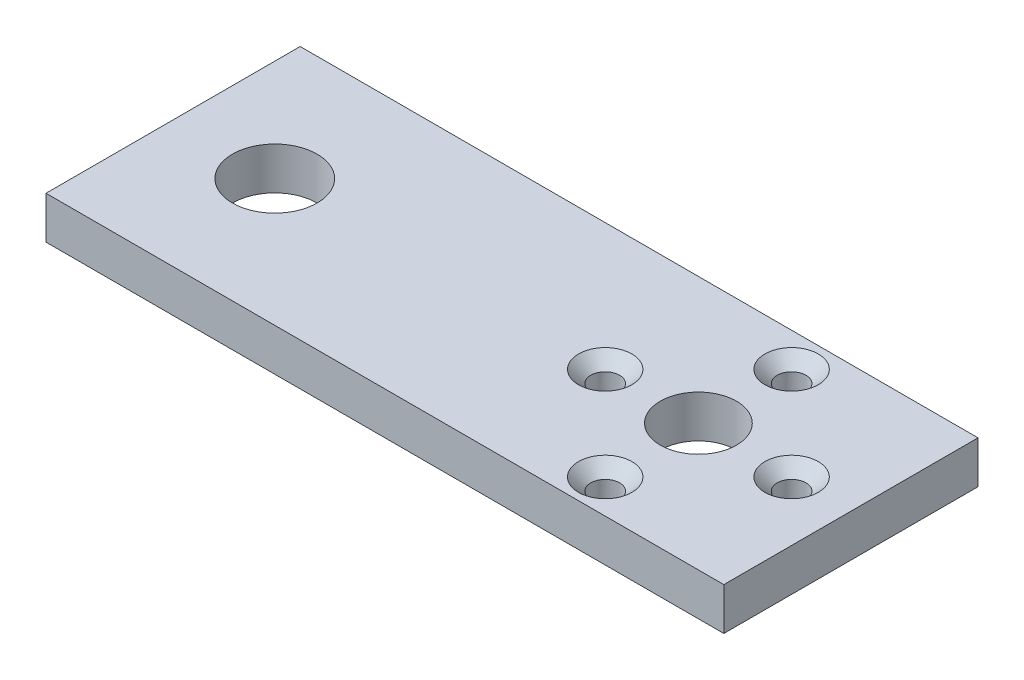
ISO-10303-21;
HEADER;
FILE_DESCRIPTION(('STEP AP214'),'2;1');
FILE_NAME('part.step','',(''),(''),'','','');
FILE_SCHEMA(('AUTOMOTIVE_DESIGN { 1 0 10303 214 1 1 1 1 }'));
ENDSEC;
DATA;
#1=APPLICATION_CONTEXT('core data for automotive mechanical design processes');
#2=APPLICATION_PROTOCOL_DEFINITION('international standard','automotive_design',2000,#1);
#3=PRODUCT_CONTEXT('',#1,'mechanical');
#4=PRODUCT('Part','Part','',(#3));
#5=PRODUCT_RELATED_PRODUCT_CATEGORY('part','',(#4));
#6=PRODUCT_DEFINITION_FORMATION('','',#4);
#7=PRODUCT_DEFINITION_CONTEXT('part definition',#1,'design');
#8=PRODUCT_DEFINITION('design','',#6,#7);
#9=PRODUCT_DEFINITION_SHAPE('','',#8);
#10=(LENGTH_UNIT() NAMED_UNIT(*) SI_UNIT(.MILLI.,.METRE.));
#11=(NAMED_UNIT(*) PLANE_ANGLE_UNIT() SI_UNIT($,.RADIAN.));
#12=(NAMED_UNIT(*) SI_UNIT($,.STERADIAN.) SOLID_ANGLE_UNIT());
#13=UNCERTAINTY_MEASURE_WITH_UNIT(LENGTH_MEASURE(1.E-05),#10,'distance_accuracy_value','');
#14=(GEOMETRIC_REPRESENTATION_CONTEXT(3) GLOBAL_UNCERTAINTY_ASSIGNED_CONTEXT((#13)) GLOBAL_UNIT_ASSIGNED_CONTEXT((#10,
#11,#12)) REPRESENTATION_CONTEXT('',''));
#15=CARTESIAN_POINT('',(0.,0.,0.));
#16=DIRECTION('',(0.,0.,1.));
#17=DIRECTION('',(1.,0.,0.));
#18=AXIS2_PLACEMENT_3D('',#15,#16,#17);
#19=CARTESIAN_POINT('',(0.,5.,0.));
#20=DIRECTION('',(0.,-1.,0.));
#21=DIRECTION('',(0.,0.,-1.));
#22=AXIS2_PLACEMENT_3D('',#19,#20,#21);
#23=PLANE('',#22);
#24=CARTESIAN_POINT('',(21.9999999999999,5.,11.));
#25=DIRECTION('',(0.,1.,0.));
#26=DIRECTION('',(0.,0.,1.));
#27=AXIS2_PLACEMENT_3D('',#24,#25,#26);
#28=CIRCLE('',#27,3.15);
#29=CARTESIAN_POINT('',(21.9999999999999,5.,14.15));
#30=VERTEX_POINT('',#29);
#31=EDGE_CURVE('E266',#30,#30,#28,.T.);
#32=ORIENTED_EDGE('',*,*,#31,.F.);
#33=EDGE_LOOP('',(#32));
#34=FACE_BOUND('',#33,.T.);
#35=CARTESIAN_POINT('',(22.,5.,-11.));
#36=DIRECTION('',(0.,1.,0.));
#37=DIRECTION('',(0.,0.,1.));
#38=AXIS2_PLACEMENT_3D('',#35,#36,#37);
#39=CIRCLE('',#38,3.15);
#40=CARTESIAN_POINT('',(22.,5.,-7.85));
#41=VERTEX_POINT('',#40);
#42=EDGE_CURVE('E242',#41,#41,#39,.T.);
#43=ORIENTED_EDGE('',*,*,#42,.F.);
#44=EDGE_LOOP('',(#43));
#45=FACE_BOUND('',#44,.T.);
#46=CARTESIAN_POINT('',(11.,5.,0.));
#47=DIRECTION('',(0.,1.,0.));
#48=DIRECTION('',(0.,0.,1.));
#49=AXIS2_PLACEMENT_3D('',#46,#47,#48);
#50=CIRCLE('',#49,3.15);
#51=CARTESIAN_POINT('',(11.,5.,3.15));
#52=VERTEX_POINT('',#51);
#53=EDGE_CURVE('E230',#52,#52,#50,.T.);
#54=ORIENTED_EDGE('',*,*,#53,.F.);
#55=EDGE_LOOP('',(#54));
#56=FACE_BOUND('',#55,.T.);
#57=DIRECTION('',(0.,0.,-1.));
#58=VECTOR('',#57,1.);
#59=CARTESIAN_POINT('',(-40.,5.,15.));
#60=LINE('',#59,#58);
#61=CARTESIAN_POINT('',(-40.,5.,15.));
#62=VERTEX_POINT('',#61);
#63=CARTESIAN_POINT('',(-40.,5.,-15.));
#64=VERTEX_POINT('',#63);
#65=EDGE_CURVE('E146',#62,#64,#60,.T.);
#66=ORIENTED_EDGE('',*,*,#65,.F.);
#67=DIRECTION('',(1.,0.,0.));
#68=VECTOR('',#67,1.);
#69=CARTESIAN_POINT('',(-40.,5.,15.));
#70=LINE('',#69,#68);
#71=CARTESIAN_POINT('',(40.,5.,15.));
#72=VERTEX_POINT('',#71);
#73=EDGE_CURVE('E133',#62,#72,#70,.T.);
#74=ORIENTED_EDGE('',*,*,#73,.T.);
#75=DIRECTION('',(0.,0.,-1.));
#76=VECTOR('',#75,1.);
#77=CARTESIAN_POINT('',(40.,5.,15.));
#78=LINE('',#77,#76);
#79=CARTESIAN_POINT('',(40.,5.,-15.));
#80=VERTEX_POINT('',#79);
#81=EDGE_CURVE('E128',#72,#80,#78,.T.);
#82=ORIENTED_EDGE('',*,*,#81,.T.);
#83=DIRECTION('',(1.,0.,0.));
#84=VECTOR('',#83,1.);
#85=CARTESIAN_POINT('',(-40.,5.,-15.));
#86=LINE('',#85,#84);
#87=EDGE_CURVE('E132',#64,#80,#86,.T.);
#88=ORIENTED_EDGE('',*,*,#87,.F.);
#89=EDGE_LOOP('',(#66,#74,#82,#88));
#90=FACE_BOUND('',#89,.T.);
#91=CARTESIAN_POINT('',(22.,5.,0.));
#92=DIRECTION('',(0.,1.,0.));
#93=DIRECTION('',(0.,0.,1.));
#94=AXIS2_PLACEMENT_3D('',#91,#92,#93);
#95=CIRCLE('',#94,4.5);
#96=CARTESIAN_POINT('',(22.,5.,4.5));
#97=VERTEX_POINT('',#96);
#98=EDGE_CURVE('E159',#97,#97,#95,.T.);
#99=ORIENTED_EDGE('',*,*,#98,.F.);
#100=EDGE_LOOP('',(#99));
#101=FACE_BOUND('',#100,.T.);
#102=CARTESIAN_POINT('',(-28.,5.,0.));
#103=DIRECTION('',(0.,1.,0.));
#104=DIRECTION('',(0.,0.,1.));
#105=AXIS2_PLACEMENT_3D('',#102,#103,#104);
#106=CIRCLE('',#105,5.);
#107=CARTESIAN_POINT('',(-28.,5.,5.));
#108=VERTEX_POINT('',#107);
#109=EDGE_CURVE('E211',#108,#108,#106,.T.);
#110=ORIENTED_EDGE('',*,*,#109,.F.);
#111=EDGE_LOOP('',(#110));
#112=FACE_BOUND('',#111,.T.);
#113=CARTESIAN_POINT('',(33.,5.,0.));
#114=DIRECTION('',(0.,1.,0.));
#115=DIRECTION('',(0.,0.,1.));
#116=AXIS2_PLACEMENT_3D('',#113,#114,#115);
#117=CIRCLE('',#116,3.15);
#118=CARTESIAN_POINT('',(33.,5.,3.15));
#119=VERTEX_POINT('',#118);
#120=EDGE_CURVE('E254',#119,#119,#117,.T.);
#121=ORIENTED_EDGE('',*,*,#120,.F.);
#122=EDGE_LOOP('',(#121));
#123=FACE_BOUND('',#122,.T.);
#124=ADVANCED_FACE('F81',(#34,#45,#56,#90,#101,#112,#123),#23,.F.);
#125=CARTESIAN_POINT('',(0.,0.,0.));
#126=DIRECTION('',(0.,-1.,0.));
#127=DIRECTION('',(0.,0.,-1.));
#128=AXIS2_PLACEMENT_3D('',#125,#126,#127);
#129=PLANE('',#128);
#130=CARTESIAN_POINT('',(21.9999999999999,0.,11.));
#131=DIRECTION('',(0.,-1.,0.));
#132=DIRECTION('',(0.,0.,-1.));
#133=AXIS2_PLACEMENT_3D('',#130,#131,#132);
#134=CIRCLE('',#133,1.7);
#135=CARTESIAN_POINT('',(21.9999999999999,0.,9.3));
#136=VERTEX_POINT('',#135);
#137=EDGE_CURVE('E258',#136,#136,#134,.T.);
#138=ORIENTED_EDGE('',*,*,#137,.F.);
#139=EDGE_LOOP('',(#138));
#140=FACE_BOUND('',#139,.T.);
#141=CARTESIAN_POINT('',(33.,0.,0.));
#142=DIRECTION('',(0.,-1.,0.));
#143=DIRECTION('',(0.,0.,-1.));
#144=AXIS2_PLACEMENT_3D('',#141,#142,#143);
#145=CIRCLE('',#144,1.7);
#146=CARTESIAN_POINT('',(33.,0.,-1.7));
#147=VERTEX_POINT('',#146);
#148=EDGE_CURVE('E246',#147,#147,#145,.T.);
#149=ORIENTED_EDGE('',*,*,#148,.F.);
#150=EDGE_LOOP('',(#149));
#151=FACE_BOUND('',#150,.T.);
#152=CARTESIAN_POINT('',(22.,0.,-11.));
#153=DIRECTION('',(0.,-1.,0.));
#154=DIRECTION('',(0.,0.,-1.));
#155=AXIS2_PLACEMENT_3D('',#152,#153,#154);
#156=CIRCLE('',#155,1.7);
#157=CARTESIAN_POINT('',(22.,0.,-12.7));
#158=VERTEX_POINT('',#157);
#159=EDGE_CURVE('E234',#158,#158,#156,.T.);
#160=ORIENTED_EDGE('',*,*,#159,.F.);
#161=EDGE_LOOP('',(#160));
#162=FACE_BOUND('',#161,.T.);
#163=CARTESIAN_POINT('',(11.,0.,0.));
#164=DIRECTION('',(0.,-1.,0.));
#165=DIRECTION('',(0.,0.,-1.));
#166=AXIS2_PLACEMENT_3D('',#163,#164,#165);
#167=CIRCLE('',#166,1.7);
#168=CARTESIAN_POINT('',(11.,0.,-1.7));
#169=VERTEX_POINT('',#168);
#170=EDGE_CURVE('E221',#169,#169,#167,.T.);
#171=ORIENTED_EDGE('',*,*,#170,.F.);
#172=EDGE_LOOP('',(#171));
#173=FACE_BOUND('',#172,.T.);
#174=CARTESIAN_POINT('',(22.,0.,0.));
#175=DIRECTION('',(0.,1.,0.));
#176=DIRECTION('',(0.,0.,1.));
#177=AXIS2_PLACEMENT_3D('',#174,#175,#176);
#178=CIRCLE('',#177,4.5);
#179=CARTESIAN_POINT('',(22.,0.,4.5));
#180=VERTEX_POINT('',#179);
#181=EDGE_CURVE('E208',#180,#180,#178,.T.);
#182=ORIENTED_EDGE('',*,*,#181,.T.);
#183=EDGE_LOOP('',(#182));
#184=FACE_BOUND('',#183,.T.);
#185=DIRECTION('',(0.,0.,-1.));
#186=VECTOR('',#185,1.);
#187=CARTESIAN_POINT('',(-40.,0.,15.));
#188=LINE('',#187,#186);
#189=CARTESIAN_POINT('',(-40.,0.,15.));
#190=VERTEX_POINT('',#189);
#191=CARTESIAN_POINT('',(-40.,0.,-15.));
#192=VERTEX_POINT('',#191);
#193=EDGE_CURVE('E154',#190,#192,#188,.T.);
#194=ORIENTED_EDGE('',*,*,#193,.T.);
#195=DIRECTION('',(1.,0.,0.));
#196=VECTOR('',#195,1.);
#197=CARTESIAN_POINT('',(-40.,0.,-15.));
#198=LINE('',#197,#196);
#199=CARTESIAN_POINT('',(40.,0.,-15.));
#200=VERTEX_POINT('',#199);
#201=EDGE_CURVE('E158',#192,#200,#198,.T.);
#202=ORIENTED_EDGE('',*,*,#201,.T.);
#203=DIRECTION('',(0.,0.,-1.));
#204=VECTOR('',#203,1.);
#205=CARTESIAN_POINT('',(40.,0.,15.));
#206=LINE('',#205,#204);
#207=CARTESIAN_POINT('',(40.,0.,15.));
#208=VERTEX_POINT('',#207);
#209=EDGE_CURVE('E141',#208,#200,#206,.T.);
#210=ORIENTED_EDGE('',*,*,#209,.F.);
#211=DIRECTION('',(1.,0.,0.));
#212=VECTOR('',#211,1.);
#213=CARTESIAN_POINT('',(-40.,0.,15.));
#214=LINE('',#213,#212);
#215=EDGE_CURVE('E116',#190,#208,#214,.T.);
#216=ORIENTED_EDGE('',*,*,#215,.F.);
#217=EDGE_LOOP('',(#194,#202,#210,#216));
#218=FACE_BOUND('',#217,.T.);
#219=CARTESIAN_POINT('',(-28.,0.,0.));
#220=DIRECTION('',(0.,1.,0.));
#221=DIRECTION('',(0.,0.,1.));
#222=AXIS2_PLACEMENT_3D('',#219,#220,#221);
#223=CIRCLE('',#222,5.);
#224=CARTESIAN_POINT('',(-28.,0.,5.));
#225=VERTEX_POINT('',#224);
#226=EDGE_CURVE('E216',#225,#225,#223,.T.);
#227=ORIENTED_EDGE('',*,*,#226,.T.);
#228=EDGE_LOOP('',(#227));
#229=FACE_BOUND('',#228,.T.);
#230=ADVANCED_FACE('F168',(#140,#151,#162,#173,#184,#218,#229),#129,.T.);
#231=CARTESIAN_POINT('',(-40.,5.,15.));
#232=DIRECTION('',(-1.,0.,0.));
#233=DIRECTION('',(0.,0.,1.));
#234=AXIS2_PLACEMENT_3D('',#231,#232,#233);
#235=PLANE('',#234);
#236=ORIENTED_EDGE('',*,*,#193,.F.);
#237=DIRECTION('',(0.,-1.,0.));
#238=VECTOR('',#237,1.);
#239=CARTESIAN_POINT('',(-40.,5.,15.));
#240=LINE('',#239,#238);
#241=EDGE_CURVE('E14',#62,#190,#240,.T.);
#242=ORIENTED_EDGE('',*,*,#241,.F.);
#243=ORIENTED_EDGE('',*,*,#65,.T.);
#244=DIRECTION('',(0.,-1.,0.));
#245=VECTOR('',#244,1.);
#246=CARTESIAN_POINT('',(-40.,5.,-15.));
#247=LINE('',#246,#245);
#248=EDGE_CURVE('E85',#64,#192,#247,.T.);
#249=ORIENTED_EDGE('',*,*,#248,.T.);
#250=EDGE_LOOP('',(#236,#242,#243,#249));
#251=FACE_BOUND('',#250,.T.);
#252=ADVANCED_FACE('F83',(#251),#235,.T.);
#253=CARTESIAN_POINT('',(-40.,5.,15.));
#254=DIRECTION('',(0.,0.,-1.));
#255=DIRECTION('',(-1.,0.,0.));
#256=AXIS2_PLACEMENT_3D('',#253,#254,#255);
#257=PLANE('',#256);
#258=ORIENTED_EDGE('',*,*,#215,.T.);
#259=DIRECTION('',(0.,-1.,0.));
#260=VECTOR('',#259,1.);
#261=CARTESIAN_POINT('',(40.,5.,15.));
#262=LINE('',#261,#260);
#263=EDGE_CURVE('E92',#72,#208,#262,.T.);
#264=ORIENTED_EDGE('',*,*,#263,.F.);
#265=ORIENTED_EDGE('',*,*,#73,.F.);
#266=ORIENTED_EDGE('',*,*,#241,.T.);
#267=EDGE_LOOP('',(#258,#264,#265,#266));
#268=FACE_BOUND('',#267,.T.);
#269=ADVANCED_FACE('F172',(#268),#257,.F.);
#270=CARTESIAN_POINT('',(40.,5.,15.));
#271=DIRECTION('',(-1.,0.,0.));
#272=DIRECTION('',(0.,0.,1.));
#273=AXIS2_PLACEMENT_3D('',#270,#271,#272);
#274=PLANE('',#273);
#275=ORIENTED_EDGE('',*,*,#209,.T.);
#276=DIRECTION('',(0.,-1.,0.));
#277=VECTOR('',#276,1.);
#278=CARTESIAN_POINT('',(40.,5.,-15.));
#279=LINE('',#278,#277);
#280=EDGE_CURVE('E138',#80,#200,#279,.T.);
#281=ORIENTED_EDGE('',*,*,#280,.F.);
#282=ORIENTED_EDGE('',*,*,#81,.F.);
#283=ORIENTED_EDGE('',*,*,#263,.T.);
#284=EDGE_LOOP('',(#275,#281,#282,#283));
#285=FACE_BOUND('',#284,.T.);
#286=ADVANCED_FACE('F139',(#285),#274,.F.);
#287=CARTESIAN_POINT('',(-40.,5.,-15.));
#288=DIRECTION('',(0.,0.,-1.));
#289=DIRECTION('',(-1.,0.,0.));
#290=AXIS2_PLACEMENT_3D('',#287,#288,#289);
#291=PLANE('',#290);
#292=ORIENTED_EDGE('',*,*,#201,.F.);
#293=ORIENTED_EDGE('',*,*,#248,.F.);
#294=ORIENTED_EDGE('',*,*,#87,.T.);
#295=ORIENTED_EDGE('',*,*,#280,.T.);
#296=EDGE_LOOP('',(#292,#293,#294,#295));
#297=FACE_BOUND('',#296,.T.);
#298=ADVANCED_FACE('F144',(#297),#291,.T.);
#299=CARTESIAN_POINT('',(22.,5.,0.));
#300=DIRECTION('',(0.,-1.,0.));
#301=DIRECTION('',(0.,0.,-1.));
#302=AXIS2_PLACEMENT_3D('',#299,#300,#301);
#303=CYLINDRICAL_SURFACE('',#302,4.5);
#304=ORIENTED_EDGE('',*,*,#98,.T.);
#305=EDGE_LOOP('',(#304));
#306=FACE_BOUND('',#305,.T.);
#307=ORIENTED_EDGE('',*,*,#181,.F.);
#308=EDGE_LOOP('',(#307));
#309=FACE_BOUND('',#308,.T.);
#310=ADVANCED_FACE('F188',(#306,#309),#303,.F.);
#311=CARTESIAN_POINT('',(-28.,5.,0.));
#312=DIRECTION('',(0.,-1.,0.));
#313=DIRECTION('',(0.,0.,-1.));
#314=AXIS2_PLACEMENT_3D('',#311,#312,#313);
#315=CYLINDRICAL_SURFACE('',#314,5.);
#316=ORIENTED_EDGE('',*,*,#109,.T.);
#317=EDGE_LOOP('',(#316));
#318=FACE_BOUND('',#317,.T.);
#319=ORIENTED_EDGE('',*,*,#226,.F.);
#320=EDGE_LOOP('',(#319));
#321=FACE_BOUND('',#320,.T.);
#322=ADVANCED_FACE('F196',(#318,#321),#315,.F.);
#323=CARTESIAN_POINT('',(11.,5.,0.));
#324=DIRECTION('',(0.,1.,0.));
#325=DIRECTION('',(0.,0.,1.));
#326=AXIS2_PLACEMENT_3D('',#323,#324,#325);
#327=CYLINDRICAL_SURFACE('',#326,1.7);
#328=CARTESIAN_POINT('',(11.,3.55,0.));
#329=DIRECTION('',(0.,1.,0.));
#330=DIRECTION('',(0.,0.,1.));
#331=AXIS2_PLACEMENT_3D('',#328,#329,#330);
#332=CIRCLE('',#331,1.7);
#333=CARTESIAN_POINT('',(11.,3.55,1.7));
#334=VERTEX_POINT('',#333);
#335=EDGE_CURVE('E226',#334,#334,#332,.T.);
#336=ORIENTED_EDGE('',*,*,#335,.T.);
#337=EDGE_LOOP('',(#336));
#338=FACE_BOUND('',#337,.T.);
#339=ORIENTED_EDGE('',*,*,#170,.T.);
#340=EDGE_LOOP('',(#339));
#341=FACE_BOUND('',#340,.T.);
#342=ADVANCED_FACE('F201',(#338,#341),#327,.F.);
#343=CARTESIAN_POINT('',(11.,5.,0.));
#344=DIRECTION('',(0.,1.,0.));
#345=DIRECTION('',(0.,0.,1.));
#346=AXIS2_PLACEMENT_3D('',#343,#344,#345);
#347=CONICAL_SURFACE('',#346,3.15,0.78539816339745);
#348=ORIENTED_EDGE('',*,*,#335,.F.);
#349=EDGE_LOOP('',(#348));
#350=FACE_BOUND('',#349,.T.);
#351=ORIENTED_EDGE('',*,*,#53,.T.);
#352=EDGE_LOOP('',(#351));
#353=FACE_BOUND('',#352,.T.);
#354=ADVANCED_FACE('F297',(#350,#353),#347,.F.);
#355=CARTESIAN_POINT('',(22.,5.,-11.));
#356=DIRECTION('',(0.,1.,0.));
#357=DIRECTION('',(0.,0.,1.));
#358=AXIS2_PLACEMENT_3D('',#355,#356,#357);
#359=CYLINDRICAL_SURFACE('',#358,1.7);
#360=CARTESIAN_POINT('',(22.,3.55,-11.));
#361=DIRECTION('',(0.,1.,0.));
#362=DIRECTION('',(0.,0.,1.));
#363=AXIS2_PLACEMENT_3D('',#360,#361,#362);
#364=CIRCLE('',#363,1.7);
#365=CARTESIAN_POINT('',(22.,3.55,-9.3));
#366=VERTEX_POINT('',#365);
#367=EDGE_CURVE('E238',#366,#366,#364,.T.);
#368=ORIENTED_EDGE('',*,*,#367,.T.);
#369=EDGE_LOOP('',(#368));
#370=FACE_BOUND('',#369,.T.);
#371=ORIENTED_EDGE('',*,*,#159,.T.);
#372=EDGE_LOOP('',(#371));
#373=FACE_BOUND('',#372,.T.);
#374=ADVANCED_FACE('F293',(#370,#373),#359,.F.);
#375=CARTESIAN_POINT('',(22.,5.,-11.));
#376=DIRECTION('',(0.,1.,0.));
#377=DIRECTION('',(0.,0.,1.));
#378=AXIS2_PLACEMENT_3D('',#375,#376,#377);
#379=CONICAL_SURFACE('',#378,3.15,0.785398163397449);
#380=ORIENTED_EDGE('',*,*,#367,.F.);
#381=EDGE_LOOP('',(#380));
#382=FACE_BOUND('',#381,.T.);
#383=ORIENTED_EDGE('',*,*,#42,.T.);
#384=EDGE_LOOP('',(#383));
#385=FACE_BOUND('',#384,.T.);
#386=ADVANCED_FACE('F289',(#382,#385),#379,.F.);
#387=CARTESIAN_POINT('',(33.,5.,0.));
#388=DIRECTION('',(0.,1.,0.));
#389=DIRECTION('',(0.,0.,1.));
#390=AXIS2_PLACEMENT_3D('',#387,#388,#389);
#391=CYLINDRICAL_SURFACE('',#390,1.7);
#392=CARTESIAN_POINT('',(33.,3.55,0.));
#393=DIRECTION('',(0.,1.,0.));
#394=DIRECTION('',(0.,0.,1.));
#395=AXIS2_PLACEMENT_3D('',#392,#393,#394);
#396=CIRCLE('',#395,1.7);
#397=CARTESIAN_POINT('',(33.,3.55,1.7));
#398=VERTEX_POINT('',#397);
#399=EDGE_CURVE('E250',#398,#398,#396,.T.);
#400=ORIENTED_EDGE('',*,*,#399,.T.);
#401=EDGE_LOOP('',(#400));
#402=FACE_BOUND('',#401,.T.);
#403=ORIENTED_EDGE('',*,*,#148,.T.);
#404=EDGE_LOOP('',(#403));
#405=FACE_BOUND('',#404,.T.);
#406=ADVANCED_FACE('F285',(#402,#405),#391,.F.);
#407=CARTESIAN_POINT('',(33.,5.,0.));
#408=DIRECTION('',(0.,1.,0.));
#409=DIRECTION('',(0.,0.,1.));
#410=AXIS2_PLACEMENT_3D('',#407,#408,#409);
#411=CONICAL_SURFACE('',#410,3.15,0.785398163397449);
#412=ORIENTED_EDGE('',*,*,#399,.F.);
#413=EDGE_LOOP('',(#412));
#414=FACE_BOUND('',#413,.T.);
#415=ORIENTED_EDGE('',*,*,#120,.T.);
#416=EDGE_LOOP('',(#415));
#417=FACE_BOUND('',#416,.T.);
#418=ADVANCED_FACE('F278',(#414,#417),#411,.F.);
#419=CARTESIAN_POINT('',(21.9999999999999,5.,11.));
#420=DIRECTION('',(0.,1.,0.));
#421=DIRECTION('',(0.,0.,1.));
#422=AXIS2_PLACEMENT_3D('',#419,#420,#421);
#423=CYLINDRICAL_SURFACE('',#422,1.7);
#424=CARTESIAN_POINT('',(21.9999999999999,3.55,11.));
#425=DIRECTION('',(0.,1.,0.));
#426=DIRECTION('',(0.,0.,1.));
#427=AXIS2_PLACEMENT_3D('',#424,#425,#426);
#428=CIRCLE('',#427,1.7);
#429=CARTESIAN_POINT('',(21.9999999999999,3.55,12.7));
#430=VERTEX_POINT('',#429);
#431=EDGE_CURVE('E262',#430,#430,#428,.T.);
#432=ORIENTED_EDGE('',*,*,#431,.T.);
#433=EDGE_LOOP('',(#432));
#434=FACE_BOUND('',#433,.T.);
#435=ORIENTED_EDGE('',*,*,#137,.T.);
#436=EDGE_LOOP('',(#435));
#437=FACE_BOUND('',#436,.T.);
#438=ADVANCED_FACE('F272',(#434,#437),#423,.F.);
#439=CARTESIAN_POINT('',(21.9999999999999,5.,11.));
#440=DIRECTION('',(0.,1.,0.));
#441=DIRECTION('',(0.,0.,1.));
#442=AXIS2_PLACEMENT_3D('',#439,#440,#441);
#443=CONICAL_SURFACE('',#442,3.15,0.785398163397449);
#444=ORIENTED_EDGE('',*,*,#431,.F.);
#445=EDGE_LOOP('',(#444));
#446=FACE_BOUND('',#445,.T.);
#447=ORIENTED_EDGE('',*,*,#31,.T.);
#448=EDGE_LOOP('',(#447));
#449=FACE_BOUND('',#448,.T.);
#450=ADVANCED_FACE('F270',(#446,#449),#443,.F.);
#451=CLOSED_SHELL('',(#124,#230,#252,#269,#286,#298,#310,#322,#342,#354,#374,#386,#406,#418,
#438,#450));
#452=MANIFOLD_SOLID_BREP('B2',#451);
#453=ADVANCED_BREP_SHAPE_REPRESENTATION('',(#18,#452),#14);
#454=SHAPE_DEFINITION_REPRESENTATION(#9,#453);
ENDSEC;
END-ISO-10303-21;
